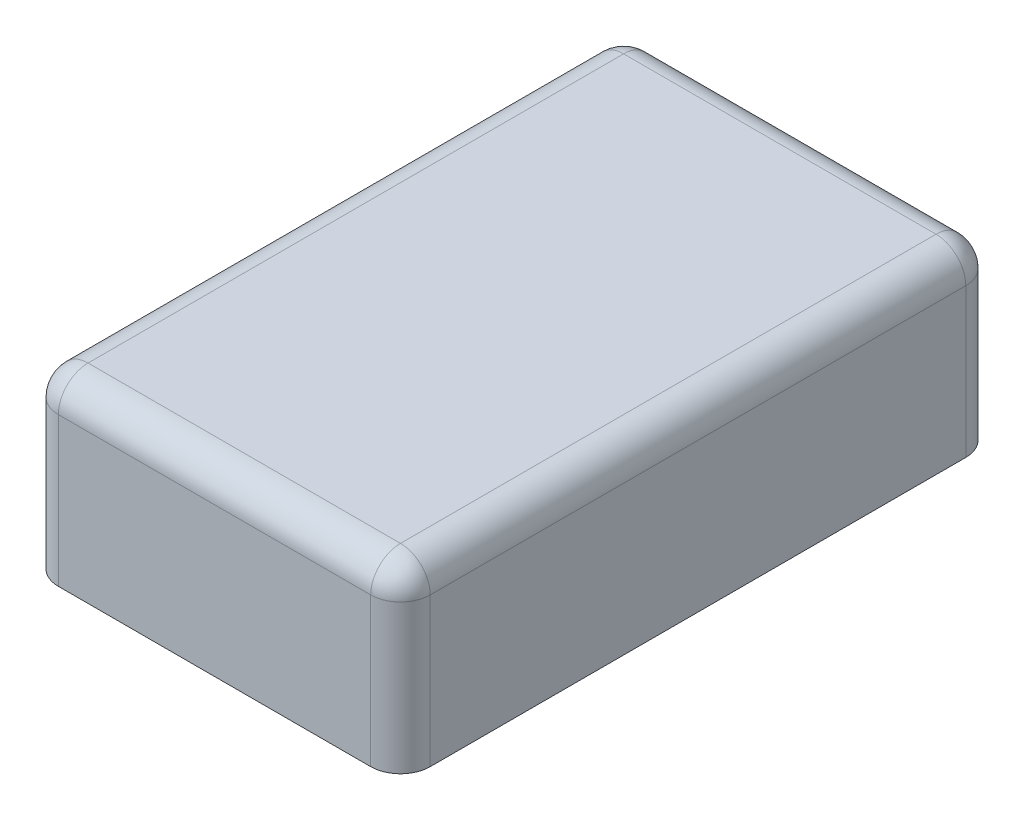
ISO-10303-21;
HEADER;
FILE_DESCRIPTION(('STEP AP214'),'2;1');
FILE_NAME('part.step','',(''),(''),'','','');
FILE_SCHEMA(('AUTOMOTIVE_DESIGN { 1 0 10303 214 1 1 1 1 }'));
ENDSEC;
DATA;
#1=APPLICATION_CONTEXT('core data for automotive mechanical design processes');
#2=APPLICATION_PROTOCOL_DEFINITION('international standard','automotive_design',2000,#1);
#3=PRODUCT_CONTEXT('',#1,'mechanical');
#4=PRODUCT('Part','Part','',(#3));
#5=PRODUCT_RELATED_PRODUCT_CATEGORY('part','',(#4));
#6=PRODUCT_DEFINITION_FORMATION('','',#4);
#7=PRODUCT_DEFINITION_CONTEXT('part definition',#1,'design');
#8=PRODUCT_DEFINITION('design','',#6,#7);
#9=PRODUCT_DEFINITION_SHAPE('','',#8);
#10=(LENGTH_UNIT() NAMED_UNIT(*) SI_UNIT(.MILLI.,.METRE.));
#11=(NAMED_UNIT(*) PLANE_ANGLE_UNIT() SI_UNIT($,.RADIAN.));
#12=(NAMED_UNIT(*) SI_UNIT($,.STERADIAN.) SOLID_ANGLE_UNIT());
#13=UNCERTAINTY_MEASURE_WITH_UNIT(LENGTH_MEASURE(1.E-05),#10,'distance_accuracy_value','');
#14=(GEOMETRIC_REPRESENTATION_CONTEXT(3) GLOBAL_UNCERTAINTY_ASSIGNED_CONTEXT((#13)) GLOBAL_UNIT_ASSIGNED_CONTEXT((#10,
#11,#12)) REPRESENTATION_CONTEXT('',''));
#15=CARTESIAN_POINT('',(0.,0.,0.));
#16=DIRECTION('',(0.,0.,1.));
#17=DIRECTION('',(1.,0.,0.));
#18=AXIS2_PLACEMENT_3D('',#15,#16,#17);
#19=CARTESIAN_POINT('',(0.763000000000017,1.69999999999999,6.87000000000001));
#20=DIRECTION('',(1.,0.,0.));
#21=DIRECTION('',(0.,0.,-1.));
#22=AXIS2_PLACEMENT_3D('',#19,#20,#21);
#23=CYLINDRICAL_SURFACE('',#22,0.10000000000001);
#24=CARTESIAN_POINT('',(-2.38699999999995,1.69999999999997,6.86999999999998));
#25=DIRECTION('',(-1.,-3.02591285360687E-13,7.97606969011573E-13));
#26=DIRECTION('',(7.98124330671143E-13,7.97606969011331E-13,1.));
#27=AXIS2_PLACEMENT_3D('',#24,#25,#26);
#28=CIRCLE('',#27,0.100000000000003);
#29=CARTESIAN_POINT('',(-2.38699999999998,1.8,6.87));
#30=VERTEX_POINT('',#29);
#31=CARTESIAN_POINT('',(-2.38699999999999,1.69999999999997,6.76999999999999));
#32=VERTEX_POINT('',#31);
#33=EDGE_CURVE('E208',#30,#32,#28,.T.);
#34=ORIENTED_EDGE('',*,*,#33,.F.);
#35=DIRECTION('',(1.,0.,0.));
#36=VECTOR('',#35,1.);
#37=CARTESIAN_POINT('',(-2.61319999999998,1.8,6.87));
#38=LINE('',#37,#36);
#39=CARTESIAN_POINT('',(-1.33700000008429,1.8,6.87));
#40=VERTEX_POINT('',#39);
#41=EDGE_CURVE('E105',#40,#30,#38,.F.);
#42=ORIENTED_EDGE('',*,*,#41,.F.);
#43=CARTESIAN_POINT('',(-1.337,1.69999999999996,6.87000000000001));
#44=DIRECTION('',(-1.,-3.37218852841659E-09,-6.78279939863939E-13));
#45=DIRECTION('',(-6.7888892771889E-13,6.78279942149172E-13,1.));
#46=AXIS2_PLACEMENT_3D('',#43,#44,#45);
#47=CIRCLE('',#46,0.100000000000024);
#48=CARTESIAN_POINT('',(-1.33699999999997,1.69999999999997,6.76999999999999));
#49=VERTEX_POINT('',#48);
#50=EDGE_CURVE('E136',#49,#40,#47,.F.);
#51=ORIENTED_EDGE('',*,*,#50,.F.);
#52=DIRECTION('',(-1.,0.,0.));
#53=VECTOR('',#52,1.);
#54=CARTESIAN_POINT('',(-2.61319999999998,1.7,6.77));
#55=LINE('',#54,#53);
#56=EDGE_CURVE('E159',#32,#49,#55,.F.);
#57=ORIENTED_EDGE('',*,*,#56,.F.);
#58=EDGE_LOOP('',(#34,#42,#51,#57));
#59=FACE_BOUND('',#58,.T.);
#60=ADVANCED_FACE('F17',(#59),#23,.T.);
#61=CARTESIAN_POINT('',(-1.337,1.69999999999996,6.87000000000001));
#62=DIRECTION('',(-6.78279942151227E-13,6.78279942151225E-13,1.));
#63=DIRECTION('',(0.707106781187225,0.70710678118587,0.));
#64=AXIS2_PLACEMENT_3D('',#61,#62,#63);
#65=SPHERICAL_SURFACE('',#64,0.100000000000024);
#66=ORIENTED_EDGE('',*,*,#50,.T.);
#67=CARTESIAN_POINT('',(-1.33699999999999,1.7,6.87));
#68=DIRECTION('',(0.,0.,-1.));
#69=DIRECTION('',(-1.,0.,0.));
#70=AXIS2_PLACEMENT_3D('',#67,#68,#69);
#71=CIRCLE('',#70,0.100000000000004);
#72=CARTESIAN_POINT('',(-1.23699999999998,1.7,6.87));
#73=VERTEX_POINT('',#72);
#74=EDGE_CURVE('E125',#73,#40,#71,.F.);
#75=ORIENTED_EDGE('',*,*,#74,.F.);
#76=CARTESIAN_POINT('',(-1.33699999999999,1.7,6.87));
#77=DIRECTION('',(0.,1.,0.));
#78=DIRECTION('',(0.,0.,1.));
#79=AXIS2_PLACEMENT_3D('',#76,#77,#78);
#80=CIRCLE('',#79,0.100000000000008);
#81=EDGE_CURVE('E127',#49,#73,#80,.F.);
#82=ORIENTED_EDGE('',*,*,#81,.F.);
#83=EDGE_LOOP('',(#66,#75,#82));
#84=FACE_BOUND('',#83,.T.);
#85=ADVANCED_FACE('F138',(#84),#65,.T.);
#86=CARTESIAN_POINT('',(-1.33699999999999,1.69999999999997,8.66999999999995));
#87=DIRECTION('',(0.,0.707106781186545,0.70710678118655));
#88=DIRECTION('',(1.,0.,0.));
#89=AXIS2_PLACEMENT_3D('',#86,#87,#88);
#90=SPHERICAL_SURFACE('',#89,0.100000000000031);
#91=CARTESIAN_POINT('',(-1.33699999999998,1.7,8.67000000000001));
#92=DIRECTION('',(-1.,0.,0.));
#93=DIRECTION('',(0.,0.,1.));
#94=AXIS2_PLACEMENT_3D('',#91,#92,#93);
#95=CIRCLE('',#94,0.0999999999999941);
#96=CARTESIAN_POINT('',(-1.33699999999998,1.7,8.77));
#97=VERTEX_POINT('',#96);
#98=CARTESIAN_POINT('',(-1.33699999999998,1.77071067811867,8.74071067811865));
#99=VERTEX_POINT('',#98);
#100=EDGE_CURVE('E104',#97,#99,#95,.T.);
#101=ORIENTED_EDGE('',*,*,#100,.F.);
#102=CARTESIAN_POINT('',(-1.33699999999998,1.7,8.67000000000001));
#103=DIRECTION('',(0.,-1.,0.));
#104=DIRECTION('',(0.,0.,-1.));
#105=AXIS2_PLACEMENT_3D('',#102,#103,#104);
#106=CIRCLE('',#105,0.0999999999999945);
#107=CARTESIAN_POINT('',(-1.23699999999998,1.7,8.67000000000001));
#108=VERTEX_POINT('',#107);
#109=EDGE_CURVE('E120',#108,#97,#106,.T.);
#110=ORIENTED_EDGE('',*,*,#109,.F.);
#111=CARTESIAN_POINT('',(-1.33699999999999,1.7,8.67000000000001));
#112=DIRECTION('',(0.,0.,-1.));
#113=DIRECTION('',(-1.,0.,0.));
#114=AXIS2_PLACEMENT_3D('',#111,#112,#113);
#115=CIRCLE('',#114,0.100000000000004);
#116=CARTESIAN_POINT('',(-1.33699999999998,1.8,8.67000000000001));
#117=VERTEX_POINT('',#116);
#118=EDGE_CURVE('E117',#117,#108,#115,.T.);
#119=ORIENTED_EDGE('',*,*,#118,.F.);
#120=CARTESIAN_POINT('',(-1.33699999999998,1.7,8.67000000000001));
#121=DIRECTION('',(-1.,0.,0.));
#122=DIRECTION('',(0.,0.,1.));
#123=AXIS2_PLACEMENT_3D('',#120,#121,#122);
#124=CIRCLE('',#123,0.0999999999999941);
#125=EDGE_CURVE('E20',#99,#117,#124,.T.);
#126=ORIENTED_EDGE('',*,*,#125,.F.);
#127=EDGE_LOOP('',(#101,#110,#119,#126));
#128=FACE_BOUND('',#127,.T.);
#129=ADVANCED_FACE('F118',(#128),#90,.T.);
#130=CARTESIAN_POINT('',(-4.48699999999998,1.7,8.67000000000001));
#131=DIRECTION('',(-1.,0.,0.));
#132=DIRECTION('',(0.,0.,1.));
#133=AXIS2_PLACEMENT_3D('',#130,#131,#132);
#134=CYLINDRICAL_SURFACE('',#133,0.0999999999999941);
#135=ORIENTED_EDGE('',*,*,#125,.T.);
#136=DIRECTION('',(1.,0.,0.));
#137=VECTOR('',#136,1.);
#138=CARTESIAN_POINT('',(-2.61319999999998,1.8,8.67000000000001));
#139=LINE('',#138,#137);
#140=CARTESIAN_POINT('',(-2.38699999999998,1.8,8.67000000000001));
#141=VERTEX_POINT('',#140);
#142=EDGE_CURVE('E101',#141,#117,#139,.T.);
#143=ORIENTED_EDGE('',*,*,#142,.F.);
#144=CARTESIAN_POINT('',(-2.38699999999998,1.7,8.67000000000001));
#145=DIRECTION('',(-1.,0.,0.));
#146=DIRECTION('',(0.,0.,1.));
#147=AXIS2_PLACEMENT_3D('',#144,#145,#146);
#148=CIRCLE('',#147,0.0999999999999941);
#149=CARTESIAN_POINT('',(-2.38699999999998,1.7,8.77));
#150=VERTEX_POINT('',#149);
#151=EDGE_CURVE('E114',#150,#141,#148,.T.);
#152=ORIENTED_EDGE('',*,*,#151,.F.);
#153=DIRECTION('',(1.,0.,0.));
#154=VECTOR('',#153,1.);
#155=CARTESIAN_POINT('',(-2.61319999999998,1.7,8.77));
#156=LINE('',#155,#154);
#157=EDGE_CURVE('E192',#97,#150,#156,.F.);
#158=ORIENTED_EDGE('',*,*,#157,.F.);
#159=ORIENTED_EDGE('',*,*,#100,.T.);
#160=EDGE_LOOP('',(#135,#143,#152,#158,#159));
#161=FACE_BOUND('',#160,.T.);
#162=ADVANCED_FACE('F100',(#161),#134,.T.);
#163=CARTESIAN_POINT('',(-2.38699999999995,1.69999999999997,6.86999999999998));
#164=DIRECTION('',(7.97606969011332E-13,7.97606969011328E-13,1.));
#165=DIRECTION('',(-0.707106781187271,0.707106781185824,0.));
#166=AXIS2_PLACEMENT_3D('',#163,#164,#165);
#167=SPHERICAL_SURFACE('',#166,0.100000000000003);
#168=ORIENTED_EDGE('',*,*,#33,.T.);
#169=CARTESIAN_POINT('',(-2.38699999999998,1.7,6.87));
#170=DIRECTION('',(0.,-1.,0.));
#171=DIRECTION('',(0.,0.,-1.));
#172=AXIS2_PLACEMENT_3D('',#169,#170,#171);
#173=CIRCLE('',#172,0.100000000000007);
#174=CARTESIAN_POINT('',(-2.48699999999998,1.7,6.87));
#175=VERTEX_POINT('',#174);
#176=EDGE_CURVE('E113',#175,#32,#173,.T.);
#177=ORIENTED_EDGE('',*,*,#176,.F.);
#178=CARTESIAN_POINT('',(-2.38699999999998,1.7,6.87));
#179=DIRECTION('',(0.,0.,1.));
#180=DIRECTION('',(1.,0.,0.));
#181=AXIS2_PLACEMENT_3D('',#178,#179,#180);
#182=CIRCLE('',#181,0.100000000000006);
#183=EDGE_CURVE('E188',#30,#175,#182,.T.);
#184=ORIENTED_EDGE('',*,*,#183,.F.);
#185=EDGE_LOOP('',(#168,#177,#184));
#186=FACE_BOUND('',#185,.T.);
#187=ADVANCED_FACE('F201',(#186),#167,.T.);
#188=CARTESIAN_POINT('',(-2.387,1.69999999999998,8.67));
#189=DIRECTION('',(-0.707106781187207,-1.06137321154162E-12,0.707106781185888));
#190=DIRECTION('',(1.50100839050165E-12,-1.,0.));
#191=AXIS2_PLACEMENT_3D('',#188,#189,#190);
#192=SPHERICAL_SURFACE('',#191,0.100000000000003);
#193=ORIENTED_EDGE('',*,*,#151,.T.);
#194=CARTESIAN_POINT('',(-2.38699999999998,1.7,8.67000000000001));
#195=DIRECTION('',(0.,0.,1.));
#196=DIRECTION('',(1.,0.,0.));
#197=AXIS2_PLACEMENT_3D('',#194,#195,#196);
#198=CIRCLE('',#197,0.100000000000006);
#199=CARTESIAN_POINT('',(-2.48699999999998,1.7,8.67000000000001));
#200=VERTEX_POINT('',#199);
#201=EDGE_CURVE('E191',#200,#141,#198,.F.);
#202=ORIENTED_EDGE('',*,*,#201,.F.);
#203=CARTESIAN_POINT('',(-2.38699999999999,1.7,8.67000000000001));
#204=DIRECTION('',(0.,1.,0.));
#205=DIRECTION('',(0.,0.,1.));
#206=AXIS2_PLACEMENT_3D('',#203,#204,#205);
#207=CIRCLE('',#206,0.0999999999999923);
#208=CARTESIAN_POINT('',(-2.45771067811872,1.7,8.74071067811858));
#209=VERTEX_POINT('',#208);
#210=EDGE_CURVE('E178',#209,#200,#207,.F.);
#211=ORIENTED_EDGE('',*,*,#210,.F.);
#212=CARTESIAN_POINT('',(-2.38699999999999,1.7,8.67000000000001));
#213=DIRECTION('',(0.,1.,0.));
#214=DIRECTION('',(0.,0.,1.));
#215=AXIS2_PLACEMENT_3D('',#212,#213,#214);
#216=CIRCLE('',#215,0.0999999999999923);
#217=EDGE_CURVE('E175',#150,#209,#216,.F.);
#218=ORIENTED_EDGE('',*,*,#217,.F.);
#219=EDGE_LOOP('',(#193,#202,#211,#218));
#220=FACE_BOUND('',#219,.T.);
#221=ADVANCED_FACE('F198',(#220),#192,.T.);
#222=CARTESIAN_POINT('',(-2.61319999999998,1.8,7.0488));
#223=DIRECTION('',(0.,1.,0.));
#224=DIRECTION('',(0.,0.,1.));
#225=AXIS2_PLACEMENT_3D('',#222,#223,#224);
#226=PLANE('',#225);
#227=DIRECTION('',(0.,0.,1.));
#228=VECTOR('',#227,1.);
#229=CARTESIAN_POINT('',(-2.38699999999998,1.80000000000001,9.17000000000001));
#230=LINE('',#229,#228);
#231=EDGE_CURVE('E112',#141,#30,#230,.F.);
#232=ORIENTED_EDGE('',*,*,#231,.F.);
#233=ORIENTED_EDGE('',*,*,#142,.T.);
#234=DIRECTION('',(0.,0.,-1.));
#235=VECTOR('',#234,1.);
#236=CARTESIAN_POINT('',(-1.33699999999998,1.8,4.77));
#237=LINE('',#236,#235);
#238=EDGE_CURVE('E110',#40,#117,#237,.F.);
#239=ORIENTED_EDGE('',*,*,#238,.F.);
#240=ORIENTED_EDGE('',*,*,#41,.T.);
#241=EDGE_LOOP('',(#232,#233,#239,#240));
#242=FACE_BOUND('',#241,.T.);
#243=ADVANCED_FACE('F107',(#242),#226,.T.);
#244=CARTESIAN_POINT('',(-2.38699999999998,1.5,6.87));
#245=DIRECTION('',(0.,-1.,0.));
#246=DIRECTION('',(0.,0.,-1.));
#247=AXIS2_PLACEMENT_3D('',#244,#245,#246);
#248=CYLINDRICAL_SURFACE('',#247,0.100000000000007);
#249=DIRECTION('',(0.,1.,0.));
#250=VECTOR('',#249,1.);
#251=CARTESIAN_POINT('',(-2.38699999999998,2.4612,6.77));
#252=LINE('',#251,#250);
#253=CARTESIAN_POINT('',(-2.38699999999998,1.2,6.77));
#254=VERTEX_POINT('',#253);
#255=EDGE_CURVE('E163',#254,#32,#252,.T.);
#256=ORIENTED_EDGE('',*,*,#255,.F.);
#257=CARTESIAN_POINT('',(-2.38699999999998,1.2,6.87));
#258=DIRECTION('',(0.,-1.,0.));
#259=DIRECTION('',(0.,0.,-1.));
#260=AXIS2_PLACEMENT_3D('',#257,#258,#259);
#261=CIRCLE('',#260,0.100000000000007);
#262=CARTESIAN_POINT('',(-2.48699999999998,1.2,6.87));
#263=VERTEX_POINT('',#262);
#264=EDGE_CURVE('E238',#263,#254,#261,.T.);
#265=ORIENTED_EDGE('',*,*,#264,.F.);
#266=DIRECTION('',(0.,1.,0.));
#267=VECTOR('',#266,1.);
#268=CARTESIAN_POINT('',(-2.48699999999998,0.5388,6.87));
#269=LINE('',#268,#267);
#270=EDGE_CURVE('E216',#175,#263,#269,.F.);
#271=ORIENTED_EDGE('',*,*,#270,.F.);
#272=ORIENTED_EDGE('',*,*,#176,.T.);
#273=EDGE_LOOP('',(#256,#265,#271,#272));
#274=FACE_BOUND('',#273,.T.);
#275=ADVANCED_FACE('F284',(#274),#248,.T.);
#276=CARTESIAN_POINT('',(-2.61319999999998,2.4612,6.77));
#277=DIRECTION('',(0.,0.,-1.));
#278=DIRECTION('',(-1.,0.,0.));
#279=AXIS2_PLACEMENT_3D('',#276,#277,#278);
#280=PLANE('',#279);
#281=DIRECTION('',(0.,1.,0.));
#282=VECTOR('',#281,1.);
#283=CARTESIAN_POINT('',(-1.33699999999998,1.5,6.76999999999999));
#284=LINE('',#283,#282);
#285=CARTESIAN_POINT('',(-1.33699999999998,1.2,6.77));
#286=VERTEX_POINT('',#285);
#287=EDGE_CURVE('E152',#286,#49,#284,.T.);
#288=ORIENTED_EDGE('',*,*,#287,.F.);
#289=DIRECTION('',(1.,0.,0.));
#290=VECTOR('',#289,1.);
#291=CARTESIAN_POINT('',(-2.61319999999998,1.2,6.77));
#292=LINE('',#291,#290);
#293=EDGE_CURVE('E228',#254,#286,#292,.T.);
#294=ORIENTED_EDGE('',*,*,#293,.F.);
#295=ORIENTED_EDGE('',*,*,#255,.T.);
#296=ORIENTED_EDGE('',*,*,#56,.T.);
#297=EDGE_LOOP('',(#288,#294,#295,#296));
#298=FACE_BOUND('',#297,.T.);
#299=ADVANCED_FACE('F289',(#298),#280,.T.);
#300=CARTESIAN_POINT('',(-1.33699999999999,1.5,6.87));
#301=DIRECTION('',(0.,1.,0.));
#302=DIRECTION('',(0.,0.,1.));
#303=AXIS2_PLACEMENT_3D('',#300,#301,#302);
#304=CYLINDRICAL_SURFACE('',#303,0.100000000000008);
#305=ORIENTED_EDGE('',*,*,#287,.T.);
#306=ORIENTED_EDGE('',*,*,#81,.T.);
#307=DIRECTION('',(0.,1.,0.));
#308=VECTOR('',#307,1.);
#309=CARTESIAN_POINT('',(-1.23699999999998,2.4612,6.87));
#310=LINE('',#309,#308);
#311=CARTESIAN_POINT('',(-1.23699999999998,1.2,6.87));
#312=VERTEX_POINT('',#311);
#313=EDGE_CURVE('E122',#312,#73,#310,.T.);
#314=ORIENTED_EDGE('',*,*,#313,.F.);
#315=CARTESIAN_POINT('',(-1.33699999999999,1.2,6.87));
#316=DIRECTION('',(0.,1.,0.));
#317=DIRECTION('',(0.,0.,1.));
#318=AXIS2_PLACEMENT_3D('',#315,#316,#317);
#319=CIRCLE('',#318,0.100000000000008);
#320=EDGE_CURVE('E244',#286,#312,#319,.F.);
#321=ORIENTED_EDGE('',*,*,#320,.F.);
#322=EDGE_LOOP('',(#305,#306,#314,#321));
#323=FACE_BOUND('',#322,.T.);
#324=ADVANCED_FACE('F254',(#323),#304,.T.);
#325=CARTESIAN_POINT('',(-1.33699999999999,1.7,4.77));
#326=DIRECTION('',(0.,0.,-1.));
#327=DIRECTION('',(-1.,0.,0.));
#328=AXIS2_PLACEMENT_3D('',#325,#326,#327);
#329=CYLINDRICAL_SURFACE('',#328,0.100000000000004);
#330=DIRECTION('',(0.,0.,-1.));
#331=VECTOR('',#330,1.);
#332=CARTESIAN_POINT('',(-1.23699999999998,1.7,7.0488));
#333=LINE('',#332,#331);
#334=EDGE_CURVE('E95',#73,#108,#333,.F.);
#335=ORIENTED_EDGE('',*,*,#334,.F.);
#336=ORIENTED_EDGE('',*,*,#74,.T.);
#337=ORIENTED_EDGE('',*,*,#238,.T.);
#338=ORIENTED_EDGE('',*,*,#118,.T.);
#339=EDGE_LOOP('',(#335,#336,#337,#338));
#340=FACE_BOUND('',#339,.T.);
#341=ADVANCED_FACE('F124',(#340),#329,.T.);
#342=CARTESIAN_POINT('',(-2.38699999999999,1.5,8.67000000000001));
#343=DIRECTION('',(0.,1.,0.));
#344=DIRECTION('',(0.,0.,1.));
#345=AXIS2_PLACEMENT_3D('',#342,#343,#344);
#346=CYLINDRICAL_SURFACE('',#345,0.0999999999999923);
#347=DIRECTION('',(0.,1.,0.));
#348=VECTOR('',#347,1.);
#349=CARTESIAN_POINT('',(-2.38699999999998,0.5388,8.77));
#350=LINE('',#349,#348);
#351=CARTESIAN_POINT('',(-2.38699999999998,1.2,8.77));
#352=VERTEX_POINT('',#351);
#353=EDGE_CURVE('E223',#150,#352,#350,.F.);
#354=ORIENTED_EDGE('',*,*,#353,.F.);
#355=ORIENTED_EDGE('',*,*,#217,.T.);
#356=ORIENTED_EDGE('',*,*,#210,.T.);
#357=DIRECTION('',(0.,1.,0.));
#358=VECTOR('',#357,1.);
#359=CARTESIAN_POINT('',(-2.48699999999998,0.5388,8.67000000000001));
#360=LINE('',#359,#358);
#361=CARTESIAN_POINT('',(-2.48699999999998,1.2,8.67000000000001));
#362=VERTEX_POINT('',#361);
#363=EDGE_CURVE('E236',#362,#200,#360,.T.);
#364=ORIENTED_EDGE('',*,*,#363,.F.);
#365=CARTESIAN_POINT('',(-2.38699999999999,1.2,8.67000000000001));
#366=DIRECTION('',(0.,1.,0.));
#367=DIRECTION('',(0.,0.,1.));
#368=AXIS2_PLACEMENT_3D('',#365,#366,#367);
#369=CIRCLE('',#368,0.0999999999999923);
#370=EDGE_CURVE('E243',#352,#362,#369,.F.);
#371=ORIENTED_EDGE('',*,*,#370,.F.);
#372=EDGE_LOOP('',(#354,#355,#356,#364,#371));
#373=FACE_BOUND('',#372,.T.);
#374=ADVANCED_FACE('F293',(#373),#346,.T.);
#375=CARTESIAN_POINT('',(-1.33699999999998,1.5,8.67000000000001));
#376=DIRECTION('',(0.,-1.,0.));
#377=DIRECTION('',(0.,0.,-1.));
#378=AXIS2_PLACEMENT_3D('',#375,#376,#377);
#379=CYLINDRICAL_SURFACE('',#378,0.0999999999999945);
#380=DIRECTION('',(0.,1.,0.));
#381=VECTOR('',#380,1.);
#382=CARTESIAN_POINT('',(-1.33699999999998,0.5388,8.77));
#383=LINE('',#382,#381);
#384=CARTESIAN_POINT('',(-1.33699999999998,1.2,8.77));
#385=VERTEX_POINT('',#384);
#386=EDGE_CURVE('E219',#385,#97,#383,.T.);
#387=ORIENTED_EDGE('',*,*,#386,.F.);
#388=CARTESIAN_POINT('',(-1.33699999999998,1.2,8.67000000000001));
#389=DIRECTION('',(0.,-1.,0.));
#390=DIRECTION('',(0.,0.,-1.));
#391=AXIS2_PLACEMENT_3D('',#388,#389,#390);
#392=CIRCLE('',#391,0.0999999999999945);
#393=CARTESIAN_POINT('',(-1.23699999999998,1.2,8.67000000000001));
#394=VERTEX_POINT('',#393);
#395=EDGE_CURVE('E296',#394,#385,#392,.T.);
#396=ORIENTED_EDGE('',*,*,#395,.F.);
#397=DIRECTION('',(0.,-1.,0.));
#398=VECTOR('',#397,1.);
#399=CARTESIAN_POINT('',(-1.23699999999999,1.5,8.67000000000001));
#400=LINE('',#399,#398);
#401=EDGE_CURVE('E231',#394,#108,#400,.F.);
#402=ORIENTED_EDGE('',*,*,#401,.T.);
#403=ORIENTED_EDGE('',*,*,#109,.T.);
#404=EDGE_LOOP('',(#387,#396,#402,#403));
#405=FACE_BOUND('',#404,.T.);
#406=ADVANCED_FACE('F301',(#405),#379,.T.);
#407=CARTESIAN_POINT('',(-2.61319999999998,0.5388,8.77));
#408=DIRECTION('',(0.,0.,1.));
#409=DIRECTION('',(1.,0.,0.));
#410=AXIS2_PLACEMENT_3D('',#407,#408,#409);
#411=PLANE('',#410);
#412=ORIENTED_EDGE('',*,*,#386,.T.);
#413=ORIENTED_EDGE('',*,*,#157,.T.);
#414=ORIENTED_EDGE('',*,*,#353,.T.);
#415=DIRECTION('',(1.,0.,0.));
#416=VECTOR('',#415,1.);
#417=CARTESIAN_POINT('',(-2.61319999999998,1.2,8.77));
#418=LINE('',#417,#416);
#419=EDGE_CURVE('E181',#385,#352,#418,.F.);
#420=ORIENTED_EDGE('',*,*,#419,.F.);
#421=EDGE_LOOP('',(#412,#413,#414,#420));
#422=FACE_BOUND('',#421,.T.);
#423=ADVANCED_FACE('F294',(#422),#411,.T.);
#424=CARTESIAN_POINT('',(-2.38699999999998,1.7,9.17000000000001));
#425=DIRECTION('',(0.,0.,1.));
#426=DIRECTION('',(1.,0.,0.));
#427=AXIS2_PLACEMENT_3D('',#424,#425,#426);
#428=CYLINDRICAL_SURFACE('',#427,0.100000000000006);
#429=ORIENTED_EDGE('',*,*,#201,.T.);
#430=ORIENTED_EDGE('',*,*,#231,.T.);
#431=ORIENTED_EDGE('',*,*,#183,.T.);
#432=DIRECTION('',(0.,0.,1.));
#433=VECTOR('',#432,1.);
#434=CARTESIAN_POINT('',(-2.48699999999998,1.7,7.0488));
#435=LINE('',#434,#433);
#436=EDGE_CURVE('E179',#200,#175,#435,.F.);
#437=ORIENTED_EDGE('',*,*,#436,.F.);
#438=EDGE_LOOP('',(#429,#430,#431,#437));
#439=FACE_BOUND('',#438,.T.);
#440=ADVANCED_FACE('F274',(#439),#428,.T.);
#441=CARTESIAN_POINT('',(-1.23699999999998,2.4612,7.0488));
#442=DIRECTION('',(1.,0.,0.));
#443=DIRECTION('',(0.,0.,-1.));
#444=AXIS2_PLACEMENT_3D('',#441,#442,#443);
#445=PLANE('',#444);
#446=DIRECTION('',(0.,0.,-1.));
#447=VECTOR('',#446,1.);
#448=CARTESIAN_POINT('',(-1.23699999999998,1.2,7.0488));
#449=LINE('',#448,#447);
#450=EDGE_CURVE('E26',#312,#394,#449,.F.);
#451=ORIENTED_EDGE('',*,*,#450,.F.);
#452=ORIENTED_EDGE('',*,*,#313,.T.);
#453=ORIENTED_EDGE('',*,*,#334,.T.);
#454=ORIENTED_EDGE('',*,*,#401,.F.);
#455=EDGE_LOOP('',(#451,#452,#453,#454));
#456=FACE_BOUND('',#455,.T.);
#457=ADVANCED_FACE('F251',(#456),#445,.T.);
#458=CARTESIAN_POINT('',(-2.48699999999998,0.5388,7.0488));
#459=DIRECTION('',(-1.,0.,0.));
#460=DIRECTION('',(0.,0.,1.));
#461=AXIS2_PLACEMENT_3D('',#458,#459,#460);
#462=PLANE('',#461);
#463=DIRECTION('',(0.,0.,-1.));
#464=VECTOR('',#463,1.);
#465=CARTESIAN_POINT('',(-2.48699999999998,1.2,7.0488));
#466=LINE('',#465,#464);
#467=EDGE_CURVE('E11',#362,#263,#466,.T.);
#468=ORIENTED_EDGE('',*,*,#467,.F.);
#469=ORIENTED_EDGE('',*,*,#363,.T.);
#470=ORIENTED_EDGE('',*,*,#436,.T.);
#471=ORIENTED_EDGE('',*,*,#270,.T.);
#472=EDGE_LOOP('',(#468,#469,#470,#471));
#473=FACE_BOUND('',#472,.T.);
#474=ADVANCED_FACE('F280',(#473),#462,.T.);
#475=CARTESIAN_POINT('',(-2.61319999999998,1.2,7.0488));
#476=DIRECTION('',(0.,-1.,0.));
#477=DIRECTION('',(0.,0.,-1.));
#478=AXIS2_PLACEMENT_3D('',#475,#476,#477);
#479=PLANE('',#478);
#480=ORIENTED_EDGE('',*,*,#450,.T.);
#481=ORIENTED_EDGE('',*,*,#395,.T.);
#482=ORIENTED_EDGE('',*,*,#419,.T.);
#483=ORIENTED_EDGE('',*,*,#370,.T.);
#484=ORIENTED_EDGE('',*,*,#467,.T.);
#485=ORIENTED_EDGE('',*,*,#264,.T.);
#486=ORIENTED_EDGE('',*,*,#293,.T.);
#487=ORIENTED_EDGE('',*,*,#320,.T.);
#488=EDGE_LOOP('',(#480,#481,#482,#483,#484,#485,#486,#487));
#489=FACE_BOUND('',#488,.T.);
#490=ADVANCED_FACE('F257',(#489),#479,.T.);
#491=CLOSED_SHELL('',(#60,#85,#129,#162,#187,#221,#243,#275,#299,#324,#341,#374,#406,#423,#440,
#457,#474,#490));
#492=MANIFOLD_SOLID_BREP('B1',#491);
#493=ADVANCED_BREP_SHAPE_REPRESENTATION('',(#18,#492),#14);
#494=SHAPE_DEFINITION_REPRESENTATION(#9,#493);
ENDSEC;
END-ISO-10303-21;
